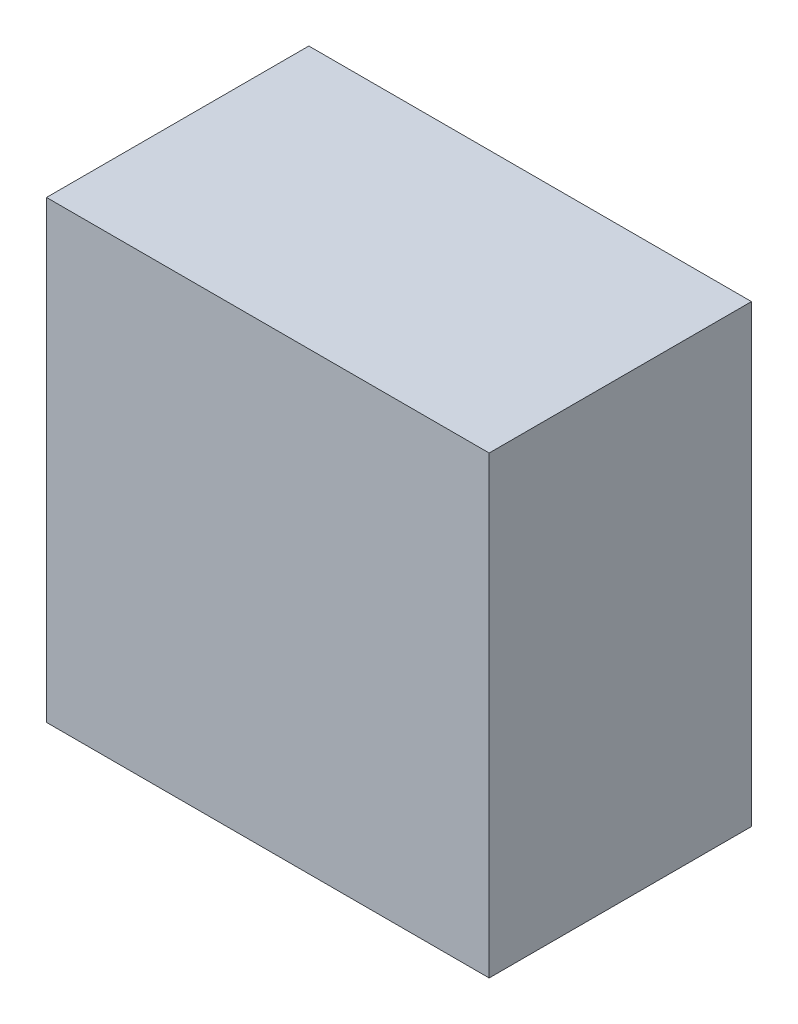
ISO-10303-21;
HEADER;
FILE_DESCRIPTION(('STEP AP214'),'2;1');
FILE_NAME('part.step','',(''),(''),'','','');
FILE_SCHEMA(('AUTOMOTIVE_DESIGN { 1 0 10303 214 1 1 1 1 }'));
ENDSEC;
DATA;
#1=APPLICATION_CONTEXT('core data for automotive mechanical design processes');
#2=APPLICATION_PROTOCOL_DEFINITION('international standard','automotive_design',2000,#1);
#3=PRODUCT_CONTEXT('',#1,'mechanical');
#4=PRODUCT('Part','Part','',(#3));
#5=PRODUCT_RELATED_PRODUCT_CATEGORY('part','',(#4));
#6=PRODUCT_DEFINITION_FORMATION('','',#4);
#7=PRODUCT_DEFINITION_CONTEXT('part definition',#1,'design');
#8=PRODUCT_DEFINITION('design','',#6,#7);
#9=PRODUCT_DEFINITION_SHAPE('','',#8);
#10=(LENGTH_UNIT() NAMED_UNIT(*) SI_UNIT(.MILLI.,.METRE.));
#11=(NAMED_UNIT(*) PLANE_ANGLE_UNIT() SI_UNIT($,.RADIAN.));
#12=(NAMED_UNIT(*) SI_UNIT($,.STERADIAN.) SOLID_ANGLE_UNIT());
#13=UNCERTAINTY_MEASURE_WITH_UNIT(LENGTH_MEASURE(1.E-05),#10,'distance_accuracy_value','');
#14=(GEOMETRIC_REPRESENTATION_CONTEXT(3) GLOBAL_UNCERTAINTY_ASSIGNED_CONTEXT((#13)) GLOBAL_UNIT_ASSIGNED_CONTEXT((#10,
#11,#12)) REPRESENTATION_CONTEXT('',''));
#15=CARTESIAN_POINT('',(0.,0.,0.));
#16=DIRECTION('',(0.,0.,1.));
#17=DIRECTION('',(1.,0.,0.));
#18=AXIS2_PLACEMENT_3D('',#15,#16,#17);
#19=CARTESIAN_POINT('',(-12.6565299729009,0.,15.));
#20=DIRECTION('',(1.,0.,0.));
#21=DIRECTION('',(0.,0.,-1.));
#22=AXIS2_PLACEMENT_3D('',#19,#20,#21);
#23=PLANE('',#22);
#24=DIRECTION('',(0.,-1.,0.));
#25=VECTOR('',#24,1.);
#26=CARTESIAN_POINT('',(-12.6565299729009,0.,0.));
#27=LINE('',#26,#25);
#28=CARTESIAN_POINT('',(-12.6565299729009,26.,0.));
#29=VERTEX_POINT('',#28);
#30=CARTESIAN_POINT('',(-12.6565299729009,0.,0.));
#31=VERTEX_POINT('',#30);
#32=EDGE_CURVE('E98',#29,#31,#27,.T.);
#33=ORIENTED_EDGE('',*,*,#32,.T.);
#34=DIRECTION('',(0.,0.,-1.));
#35=VECTOR('',#34,1.);
#36=CARTESIAN_POINT('',(-12.6565299729009,0.,15.));
#37=LINE('',#36,#35);
#38=CARTESIAN_POINT('',(-12.6565299729009,0.,15.));
#39=VERTEX_POINT('',#38);
#40=EDGE_CURVE('E11',#39,#31,#37,.T.);
#41=ORIENTED_EDGE('',*,*,#40,.F.);
#42=DIRECTION('',(0.,-1.,0.));
#43=VECTOR('',#42,1.);
#44=CARTESIAN_POINT('',(-12.6565299729009,0.,15.));
#45=LINE('',#44,#43);
#46=CARTESIAN_POINT('',(-12.6565299729009,26.,15.));
#47=VERTEX_POINT('',#46);
#48=EDGE_CURVE('E86',#47,#39,#45,.T.);
#49=ORIENTED_EDGE('',*,*,#48,.F.);
#50=DIRECTION('',(0.,0.,-1.));
#51=VECTOR('',#50,1.);
#52=CARTESIAN_POINT('',(-12.6565299729009,26.,15.));
#53=LINE('',#52,#51);
#54=EDGE_CURVE('E94',#47,#29,#53,.T.);
#55=ORIENTED_EDGE('',*,*,#54,.T.);
#56=EDGE_LOOP('',(#33,#41,#49,#55));
#57=FACE_BOUND('',#56,.T.);
#58=ADVANCED_FACE('F35',(#57),#23,.F.);
#59=CARTESIAN_POINT('',(12.6565299729009,0.,15.));
#60=DIRECTION('',(0.,1.,0.));
#61=DIRECTION('',(0.,0.,1.));
#62=AXIS2_PLACEMENT_3D('',#59,#60,#61);
#63=PLANE('',#62);
#64=DIRECTION('',(1.,0.,0.));
#65=VECTOR('',#64,1.);
#66=CARTESIAN_POINT('',(12.6565299729009,0.,0.));
#67=LINE('',#66,#65);
#68=CARTESIAN_POINT('',(12.6565299729009,0.,0.));
#69=VERTEX_POINT('',#68);
#70=EDGE_CURVE('E90',#31,#69,#67,.T.);
#71=ORIENTED_EDGE('',*,*,#70,.T.);
#72=DIRECTION('',(0.,0.,-1.));
#73=VECTOR('',#72,1.);
#74=CARTESIAN_POINT('',(12.6565299729009,0.,15.));
#75=LINE('',#74,#73);
#76=CARTESIAN_POINT('',(12.6565299729009,0.,15.));
#77=VERTEX_POINT('',#76);
#78=EDGE_CURVE('E43',#77,#69,#75,.T.);
#79=ORIENTED_EDGE('',*,*,#78,.F.);
#80=DIRECTION('',(1.,0.,0.));
#81=VECTOR('',#80,1.);
#82=CARTESIAN_POINT('',(12.6565299729009,0.,15.));
#83=LINE('',#82,#81);
#84=EDGE_CURVE('E81',#39,#77,#83,.T.);
#85=ORIENTED_EDGE('',*,*,#84,.F.);
#86=ORIENTED_EDGE('',*,*,#40,.T.);
#87=EDGE_LOOP('',(#71,#79,#85,#86));
#88=FACE_BOUND('',#87,.T.);
#89=ADVANCED_FACE('F89',(#88),#63,.F.);
#90=CARTESIAN_POINT('',(12.6565299729009,0.,15.));
#91=DIRECTION('',(-1.,0.,0.));
#92=DIRECTION('',(0.,0.,1.));
#93=AXIS2_PLACEMENT_3D('',#90,#91,#92);
#94=PLANE('',#93);
#95=DIRECTION('',(0.,1.,0.));
#96=VECTOR('',#95,1.);
#97=CARTESIAN_POINT('',(12.6565299729009,0.,0.));
#98=LINE('',#97,#96);
#99=CARTESIAN_POINT('',(12.6565299729009,26.,0.));
#100=VERTEX_POINT('',#99);
#101=EDGE_CURVE('E68',#69,#100,#98,.T.);
#102=ORIENTED_EDGE('',*,*,#101,.T.);
#103=DIRECTION('',(0.,0.,-1.));
#104=VECTOR('',#103,1.);
#105=CARTESIAN_POINT('',(12.6565299729009,26.,15.));
#106=LINE('',#105,#104);
#107=CARTESIAN_POINT('',(12.6565299729009,26.,15.));
#108=VERTEX_POINT('',#107);
#109=EDGE_CURVE('E91',#108,#100,#106,.T.);
#110=ORIENTED_EDGE('',*,*,#109,.F.);
#111=DIRECTION('',(0.,1.,0.));
#112=VECTOR('',#111,1.);
#113=CARTESIAN_POINT('',(12.6565299729009,0.,15.));
#114=LINE('',#113,#112);
#115=EDGE_CURVE('E84',#77,#108,#114,.T.);
#116=ORIENTED_EDGE('',*,*,#115,.F.);
#117=ORIENTED_EDGE('',*,*,#78,.T.);
#118=EDGE_LOOP('',(#102,#110,#116,#117));
#119=FACE_BOUND('',#118,.T.);
#120=ADVANCED_FACE('F92',(#119),#94,.F.);
#121=CARTESIAN_POINT('',(12.6565299729009,26.,15.));
#122=DIRECTION('',(0.,-1.,0.));
#123=DIRECTION('',(0.,0.,-1.));
#124=AXIS2_PLACEMENT_3D('',#121,#122,#123);
#125=PLANE('',#124);
#126=DIRECTION('',(-1.,0.,0.));
#127=VECTOR('',#126,1.);
#128=CARTESIAN_POINT('',(12.6565299729009,26.,0.));
#129=LINE('',#128,#127);
#130=EDGE_CURVE('E74',#100,#29,#129,.T.);
#131=ORIENTED_EDGE('',*,*,#130,.T.);
#132=ORIENTED_EDGE('',*,*,#54,.F.);
#133=DIRECTION('',(-1.,0.,0.));
#134=VECTOR('',#133,1.);
#135=CARTESIAN_POINT('',(12.6565299729009,26.,15.));
#136=LINE('',#135,#134);
#137=EDGE_CURVE('E51',#108,#47,#136,.T.);
#138=ORIENTED_EDGE('',*,*,#137,.F.);
#139=ORIENTED_EDGE('',*,*,#109,.T.);
#140=EDGE_LOOP('',(#131,#132,#138,#139));
#141=FACE_BOUND('',#140,.T.);
#142=ADVANCED_FACE('F105',(#141),#125,.F.);
#143=CARTESIAN_POINT('',(-12.6565299729009,26.,15.));
#144=DIRECTION('',(0.,0.,1.));
#145=DIRECTION('',(1.,0.,0.));
#146=AXIS2_PLACEMENT_3D('',#143,#144,#145);
#147=PLANE('',#146);
#148=ORIENTED_EDGE('',*,*,#48,.T.);
#149=ORIENTED_EDGE('',*,*,#84,.T.);
#150=ORIENTED_EDGE('',*,*,#115,.T.);
#151=ORIENTED_EDGE('',*,*,#137,.T.);
#152=EDGE_LOOP('',(#148,#149,#150,#151));
#153=FACE_BOUND('',#152,.T.);
#154=ADVANCED_FACE('F82',(#153),#147,.T.);
#155=CARTESIAN_POINT('',(-12.6565299729009,26.,0.));
#156=DIRECTION('',(0.,0.,1.));
#157=DIRECTION('',(1.,0.,0.));
#158=AXIS2_PLACEMENT_3D('',#155,#156,#157);
#159=PLANE('',#158);
#160=ORIENTED_EDGE('',*,*,#32,.F.);
#161=ORIENTED_EDGE('',*,*,#130,.F.);
#162=ORIENTED_EDGE('',*,*,#101,.F.);
#163=ORIENTED_EDGE('',*,*,#70,.F.);
#164=EDGE_LOOP('',(#160,#161,#162,#163));
#165=FACE_BOUND('',#164,.T.);
#166=ADVANCED_FACE('F108',(#165),#159,.F.);
#167=CLOSED_SHELL('',(#58,#89,#120,#142,#154,#166));
#168=MANIFOLD_SOLID_BREP('B2',#167);
#169=ADVANCED_BREP_SHAPE_REPRESENTATION('',(#18,#168),#14);
#170=SHAPE_DEFINITION_REPRESENTATION(#9,#169);
ENDSEC;
END-ISO-10303-21;
